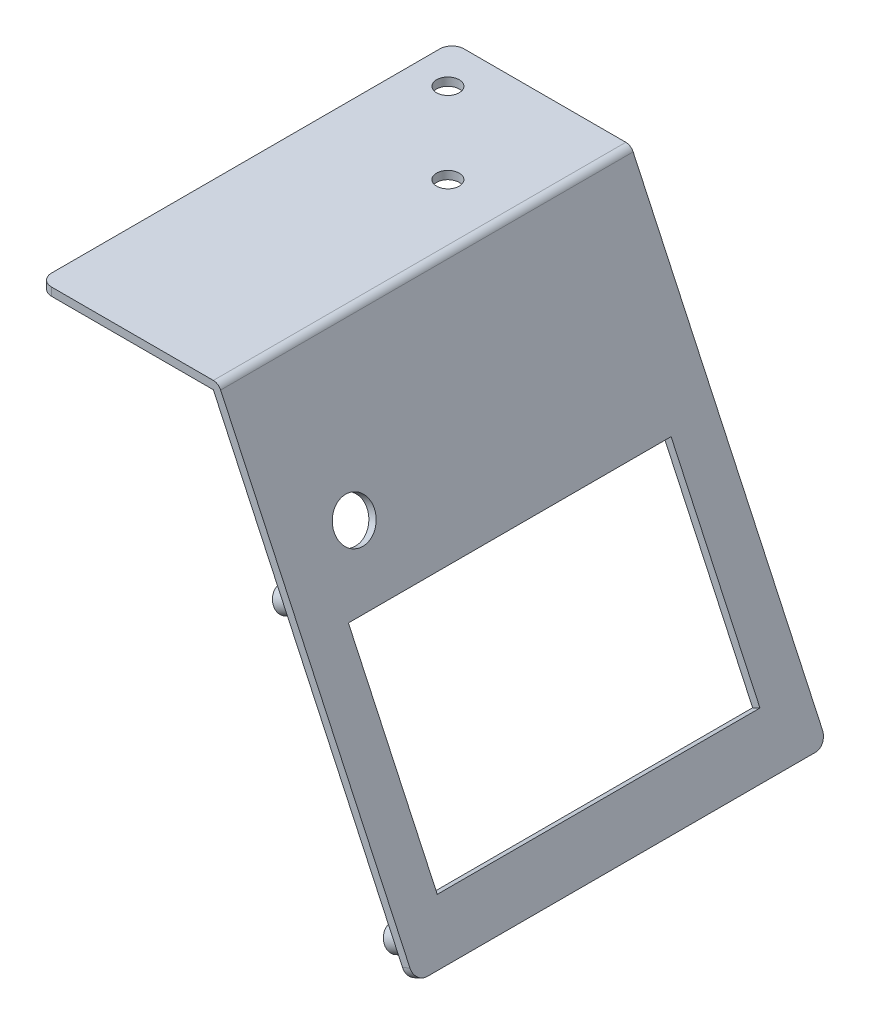
ISO-10303-21;
HEADER;
FILE_DESCRIPTION(('STEP AP214'),'2;1');
FILE_NAME('part.step','',(''),(''),'','','');
FILE_SCHEMA(('AUTOMOTIVE_DESIGN { 1 0 10303 214 1 1 1 1 }'));
ENDSEC;
DATA;
#1=APPLICATION_CONTEXT('core data for automotive mechanical design processes');
#2=APPLICATION_PROTOCOL_DEFINITION('international standard','automotive_design',2000,#1);
#3=PRODUCT_CONTEXT('',#1,'mechanical');
#4=PRODUCT('Part','Part','',(#3));
#5=PRODUCT_RELATED_PRODUCT_CATEGORY('part','',(#4));
#6=PRODUCT_DEFINITION_FORMATION('','',#4);
#7=PRODUCT_DEFINITION_CONTEXT('part definition',#1,'design');
#8=PRODUCT_DEFINITION('design','',#6,#7);
#9=PRODUCT_DEFINITION_SHAPE('','',#8);
#10=(LENGTH_UNIT() NAMED_UNIT(*) SI_UNIT(.MILLI.,.METRE.));
#11=(NAMED_UNIT(*) PLANE_ANGLE_UNIT() SI_UNIT($,.RADIAN.));
#12=(NAMED_UNIT(*) SI_UNIT($,.STERADIAN.) SOLID_ANGLE_UNIT());
#13=UNCERTAINTY_MEASURE_WITH_UNIT(LENGTH_MEASURE(1.E-05),#10,'distance_accuracy_value','');
#14=(GEOMETRIC_REPRESENTATION_CONTEXT(3) GLOBAL_UNCERTAINTY_ASSIGNED_CONTEXT((#13)) GLOBAL_UNIT_ASSIGNED_CONTEXT((#10,
#11,#12)) REPRESENTATION_CONTEXT('',''));
#15=CARTESIAN_POINT('',(0.,0.,0.));
#16=DIRECTION('',(0.,0.,1.));
#17=DIRECTION('',(1.,0.,0.));
#18=AXIS2_PLACEMENT_3D('',#15,#16,#17);
#19=CARTESIAN_POINT('',(92.8752406217959,-104.225395509215,102.));
#20=DIRECTION('',(0.422618261740697,-0.906307787036651,0.));
#21=DIRECTION('',(0.906307787036651,0.422618261740697,0.));
#22=AXIS2_PLACEMENT_3D('',#19,#20,#21);
#23=PLANE('',#22);
#24=DIRECTION('',(0.,0.,-1.));
#25=VECTOR('',#24,1.);
#26=CARTESIAN_POINT('',(92.8752406217959,-104.225395509215,102.));
#27=LINE('',#26,#25);
#28=CARTESIAN_POINT('',(92.8752406217959,-104.225395509215,99.));
#29=VERTEX_POINT('',#28);
#30=CARTESIAN_POINT('',(92.8752406217959,-104.225395509215,3.));
#31=VERTEX_POINT('',#30);
#32=EDGE_CURVE('E199',#29,#31,#27,.T.);
#33=ORIENTED_EDGE('',*,*,#32,.F.);
#34=DIRECTION('',(-0.906307787036651,-0.422618261740697,0.));
#35=VECTOR('',#34,1.);
#36=CARTESIAN_POINT('',(91.0626250477226,-105.070632032696,99.));
#37=LINE('',#36,#35);
#38=CARTESIAN_POINT('',(91.0626250477226,-105.070632032696,99.));
#39=VERTEX_POINT('',#38);
#40=EDGE_CURVE('E242',#29,#39,#37,.T.);
#41=ORIENTED_EDGE('',*,*,#40,.T.);
#42=DIRECTION('',(0.,0.,-1.));
#43=VECTOR('',#42,1.);
#44=CARTESIAN_POINT('',(91.0626250477226,-105.070632032696,102.));
#45=LINE('',#44,#43);
#46=CARTESIAN_POINT('',(91.0626250477226,-105.070632032696,3.));
#47=VERTEX_POINT('',#46);
#48=EDGE_CURVE('E190',#39,#47,#45,.T.);
#49=ORIENTED_EDGE('',*,*,#48,.T.);
#50=DIRECTION('',(-0.906307787036651,-0.422618261740697,0.));
#51=VECTOR('',#50,1.);
#52=CARTESIAN_POINT('',(92.8752406217959,-104.225395509215,3.));
#53=LINE('',#52,#51);
#54=EDGE_CURVE('E240',#47,#31,#53,.F.);
#55=ORIENTED_EDGE('',*,*,#54,.T.);
#56=EDGE_LOOP('',(#33,#41,#49,#55));
#57=FACE_BOUND('',#56,.T.);
#58=ADVANCED_FACE('F37',(#57),#23,.T.);
#59=CARTESIAN_POINT('',(44.2741405216157,3.70279042205781E-13,102.));
#60=DIRECTION('',(0.906307787036651,0.422618261740697,0.));
#61=DIRECTION('',(-0.422618261740697,0.906307787036651,0.));
#62=AXIS2_PLACEMENT_3D('',#59,#60,#61);
#63=PLANE('',#62);
#64=CARTESIAN_POINT('',(58.9366830246469,-31.4439238700159,83.1));
#65=DIRECTION('',(0.906307787036651,0.422618261740697,0.));
#66=DIRECTION('',(-0.422618261740697,0.906307787036651,0.));
#67=AXIS2_PLACEMENT_3D('',#64,#65,#66);
#68=CIRCLE('',#67,4.99999999999998);
#69=CARTESIAN_POINT('',(56.8235917159435,-26.9123849348326,83.1));
#70=VERTEX_POINT('',#69);
#71=EDGE_CURVE('E378',#70,#70,#68,.T.);
#72=ORIENTED_EDGE('',*,*,#71,.F.);
#73=EDGE_LOOP('',(#72));
#74=FACE_BOUND('',#73,.T.);
#75=DIRECTION('',(-0.422618261740704,0.906307787036648,0.));
#76=VECTOR('',#75,1.);
#77=CARTESIAN_POINT('',(87.6747248230152,-93.0728533885078,11.5000000000001));
#78=LINE('',#77,#76);
#79=CARTESIAN_POINT('',(87.6747248230152,-93.0728533885078,11.5000000000001));
#80=VERTEX_POINT('',#79);
#81=CARTESIAN_POINT('',(65.6985752124981,-45.9448484626023,11.5000000000001));
#82=VERTEX_POINT('',#81);
#83=EDGE_CURVE('E165',#80,#82,#78,.T.);
#84=ORIENTED_EDGE('',*,*,#83,.F.);
#85=DIRECTION('',(0.,0.,-1.));
#86=VECTOR('',#85,1.);
#87=CARTESIAN_POINT('',(87.6747248230152,-93.0728533885077,91.3));
#88=LINE('',#87,#86);
#89=CARTESIAN_POINT('',(87.6747248230152,-93.0728533885077,91.3));
#90=VERTEX_POINT('',#89);
#91=EDGE_CURVE('E170',#90,#80,#88,.T.);
#92=ORIENTED_EDGE('',*,*,#91,.F.);
#93=DIRECTION('',(0.422618261740704,-0.906307787036648,0.));
#94=VECTOR('',#93,1.);
#95=CARTESIAN_POINT('',(65.6985752124986,-45.944848462602,91.3));
#96=LINE('',#95,#94);
#97=CARTESIAN_POINT('',(65.6985752124986,-45.944848462602,91.3));
#98=VERTEX_POINT('',#97);
#99=EDGE_CURVE('E149',#98,#90,#96,.T.);
#100=ORIENTED_EDGE('',*,*,#99,.F.);
#101=DIRECTION('',(0.,0.,1.));
#102=VECTOR('',#101,1.);
#103=CARTESIAN_POINT('',(65.6985752124986,-45.944848462602,11.5000000000001));
#104=LINE('',#103,#102);
#105=EDGE_CURVE('E160',#82,#98,#104,.T.);
#106=ORIENTED_EDGE('',*,*,#105,.F.);
#107=EDGE_LOOP('',(#84,#92,#100,#106));
#108=FACE_BOUND('',#107,.T.);
#109=DIRECTION('',(0.422618261740697,-0.906307787036651,0.));
#110=VECTOR('',#109,1.);
#111=CARTESIAN_POINT('',(44.2741405216157,3.70279042205781E-13,102.));
#112=LINE('',#111,#110);
#113=CARTESIAN_POINT('',(44.812615574074,-1.15476347651825,102.));
#114=VERTEX_POINT('',#113);
#115=CARTESIAN_POINT('',(91.6073858365738,-101.506472148105,102.));
#116=VERTEX_POINT('',#115);
#117=EDGE_CURVE('E187',#114,#116,#112,.T.);
#118=ORIENTED_EDGE('',*,*,#117,.T.);
#119=CARTESIAN_POINT('',(91.6073858365738,-101.506472148105,99.));
#120=DIRECTION('',(0.906307787036651,0.422618261740697,0.));
#121=DIRECTION('',(-0.422618261740697,0.906307787036651,0.));
#122=AXIS2_PLACEMENT_3D('',#119,#120,#121);
#123=CIRCLE('',#122,3.);
#124=EDGE_CURVE('E255',#116,#29,#123,.T.);
#125=ORIENTED_EDGE('',*,*,#124,.T.);
#126=ORIENTED_EDGE('',*,*,#32,.T.);
#127=CARTESIAN_POINT('',(91.6073858365738,-101.506472148105,3.));
#128=DIRECTION('',(0.906307787036651,0.422618261740697,0.));
#129=DIRECTION('',(-0.422618261740697,0.906307787036651,0.));
#130=AXIS2_PLACEMENT_3D('',#127,#128,#129);
#131=CIRCLE('',#130,3.);
#132=CARTESIAN_POINT('',(91.6073858365738,-101.506472148105,0.));
#133=VERTEX_POINT('',#132);
#134=EDGE_CURVE('E253',#31,#133,#131,.T.);
#135=ORIENTED_EDGE('',*,*,#134,.T.);
#136=DIRECTION('',(0.422618261740697,-0.906307787036651,0.));
#137=VECTOR('',#136,1.);
#138=CARTESIAN_POINT('',(44.2741405216157,3.70279042205781E-13,0.));
#139=LINE('',#138,#137);
#140=CARTESIAN_POINT('',(44.812615574074,-1.15476347651825,0.));
#141=VERTEX_POINT('',#140);
#142=EDGE_CURVE('E183',#141,#133,#139,.T.);
#143=ORIENTED_EDGE('',*,*,#142,.F.);
#144=DIRECTION('',(0.,0.,-1.));
#145=VECTOR('',#144,1.);
#146=CARTESIAN_POINT('',(44.812615574074,-1.15476347651825,102.));
#147=LINE('',#146,#145);
#148=EDGE_CURVE('E235',#141,#114,#147,.F.);
#149=ORIENTED_EDGE('',*,*,#148,.T.);
#150=EDGE_LOOP('',(#118,#125,#126,#135,#143,#149));
#151=FACE_BOUND('',#150,.T.);
#152=ADVANCED_FACE('F167',(#74,#108,#151),#63,.T.);
#153=CARTESIAN_POINT('',(0.,0.,102.));
#154=DIRECTION('',(0.,1.,0.));
#155=DIRECTION('',(-1.,0.,0.));
#156=AXIS2_PLACEMENT_3D('',#153,#154,#155);
#157=PLANE('',#156);
#158=CARTESIAN_POINT('',(28.9999999999989,0.,29.9999999999999));
#159=DIRECTION('',(0.,-1.,0.));
#160=DIRECTION('',(0.,0.,-1.));
#161=AXIS2_PLACEMENT_3D('',#158,#159,#160);
#162=CIRCLE('',#161,2.80000000000105);
#163=CARTESIAN_POINT('',(28.9999999999989,0.,27.1999999999988));
#164=VERTEX_POINT('',#163);
#165=EDGE_CURVE('E388',#164,#164,#162,.T.);
#166=ORIENTED_EDGE('',*,*,#165,.T.);
#167=EDGE_LOOP('',(#166));
#168=FACE_BOUND('',#167,.T.);
#169=CARTESIAN_POINT('',(8.9999999999989,0.,9.99999999999991));
#170=DIRECTION('',(0.,-1.,0.));
#171=DIRECTION('',(0.,0.,-1.));
#172=AXIS2_PLACEMENT_3D('',#169,#170,#171);
#173=CIRCLE('',#172,2.80000000000105);
#174=CARTESIAN_POINT('',(8.9999999999989,0.,7.19999999999886));
#175=VERTEX_POINT('',#174);
#176=EDGE_CURVE('E382',#175,#175,#173,.T.);
#177=ORIENTED_EDGE('',*,*,#176,.T.);
#178=EDGE_LOOP('',(#177));
#179=FACE_BOUND('',#178,.T.);
#180=DIRECTION('',(1.,0.,0.));
#181=VECTOR('',#180,1.);
#182=CARTESIAN_POINT('',(0.,0.,0.));
#183=LINE('',#182,#181);
#184=CARTESIAN_POINT('',(3.,0.,0.));
#185=VERTEX_POINT('',#184);
#186=CARTESIAN_POINT('',(43.0000000000007,3.59622990469467E-13,0.));
#187=VERTEX_POINT('',#186);
#188=EDGE_CURVE('E195',#185,#187,#183,.T.);
#189=ORIENTED_EDGE('',*,*,#188,.F.);
#190=CARTESIAN_POINT('',(3.,0.,3.));
#191=DIRECTION('',(0.,1.,0.));
#192=DIRECTION('',(-1.,0.,0.));
#193=AXIS2_PLACEMENT_3D('',#190,#191,#192);
#194=CIRCLE('',#193,3.);
#195=CARTESIAN_POINT('',(0.,0.,3.));
#196=VERTEX_POINT('',#195);
#197=EDGE_CURVE('E265',#185,#196,#194,.T.);
#198=ORIENTED_EDGE('',*,*,#197,.T.);
#199=DIRECTION('',(0.,0.,-1.));
#200=VECTOR('',#199,1.);
#201=CARTESIAN_POINT('',(0.,0.,102.));
#202=LINE('',#201,#200);
#203=CARTESIAN_POINT('',(0.,0.,99.));
#204=VERTEX_POINT('',#203);
#205=EDGE_CURVE('E203',#204,#196,#202,.T.);
#206=ORIENTED_EDGE('',*,*,#205,.F.);
#207=CARTESIAN_POINT('',(3.,0.,99.));
#208=DIRECTION('',(0.,1.,0.));
#209=DIRECTION('',(-1.,0.,0.));
#210=AXIS2_PLACEMENT_3D('',#207,#208,#209);
#211=CIRCLE('',#210,3.);
#212=CARTESIAN_POINT('',(3.,0.,102.));
#213=VERTEX_POINT('',#212);
#214=EDGE_CURVE('E263',#204,#213,#211,.T.);
#215=ORIENTED_EDGE('',*,*,#214,.T.);
#216=DIRECTION('',(1.,0.,0.));
#217=VECTOR('',#216,1.);
#218=CARTESIAN_POINT('',(0.,0.,102.));
#219=LINE('',#218,#217);
#220=CARTESIAN_POINT('',(43.0000000000007,3.59622990469467E-13,102.));
#221=VERTEX_POINT('',#220);
#222=EDGE_CURVE('E185',#213,#221,#219,.T.);
#223=ORIENTED_EDGE('',*,*,#222,.T.);
#224=DIRECTION('',(0.,0.,-1.));
#225=VECTOR('',#224,1.);
#226=CARTESIAN_POINT('',(43.0000000000007,3.59622990469467E-13,102.));
#227=LINE('',#226,#225);
#228=EDGE_CURVE('E230',#221,#187,#227,.T.);
#229=ORIENTED_EDGE('',*,*,#228,.T.);
#230=EDGE_LOOP('',(#189,#198,#206,#215,#223,#229));
#231=FACE_BOUND('',#230,.T.);
#232=ADVANCED_FACE('F276',(#168,#179,#231),#157,.T.);
#233=CARTESIAN_POINT('',(0.,-2.,102.));
#234=DIRECTION('',(-1.,0.,0.));
#235=DIRECTION('',(0.,0.,1.));
#236=AXIS2_PLACEMENT_3D('',#233,#234,#235);
#237=PLANE('',#236);
#238=ORIENTED_EDGE('',*,*,#205,.T.);
#239=DIRECTION('',(0.,1.,0.));
#240=VECTOR('',#239,1.);
#241=CARTESIAN_POINT('',(0.,-2.,3.));
#242=LINE('',#241,#240);
#243=CARTESIAN_POINT('',(0.,-2.,3.));
#244=VERTEX_POINT('',#243);
#245=EDGE_CURVE('E52',#196,#244,#242,.F.);
#246=ORIENTED_EDGE('',*,*,#245,.T.);
#247=DIRECTION('',(0.,0.,-1.));
#248=VECTOR('',#247,1.);
#249=CARTESIAN_POINT('',(0.,-2.,102.));
#250=LINE('',#249,#248);
#251=CARTESIAN_POINT('',(0.,-2.,99.));
#252=VERTEX_POINT('',#251);
#253=EDGE_CURVE('E205',#252,#244,#250,.T.);
#254=ORIENTED_EDGE('',*,*,#253,.F.);
#255=DIRECTION('',(0.,1.,0.));
#256=VECTOR('',#255,1.);
#257=CARTESIAN_POINT('',(0.,0.,99.));
#258=LINE('',#257,#256);
#259=EDGE_CURVE('E267',#252,#204,#258,.T.);
#260=ORIENTED_EDGE('',*,*,#259,.T.);
#261=EDGE_LOOP('',(#238,#246,#254,#260));
#262=FACE_BOUND('',#261,.T.);
#263=ADVANCED_FACE('F272',(#262),#237,.T.);
#264=CARTESIAN_POINT('',(43.0000000000008,-1.99999999999965,102.));
#265=DIRECTION('',(0.,-1.,0.));
#266=DIRECTION('',(1.,0.,0.));
#267=AXIS2_PLACEMENT_3D('',#264,#265,#266);
#268=PLANE('',#267);
#269=CARTESIAN_POINT('',(28.9999999999989,-2.,29.9999999999999));
#270=DIRECTION('',(0.,-1.,0.));
#271=DIRECTION('',(0.,0.,-1.));
#272=AXIS2_PLACEMENT_3D('',#269,#270,#271);
#273=CIRCLE('',#272,2.80000000000105);
#274=CARTESIAN_POINT('',(28.9999999999989,-2.,27.1999999999988));
#275=VERTEX_POINT('',#274);
#276=EDGE_CURVE('E391',#275,#275,#273,.T.);
#277=ORIENTED_EDGE('',*,*,#276,.F.);
#278=EDGE_LOOP('',(#277));
#279=FACE_BOUND('',#278,.T.);
#280=CARTESIAN_POINT('',(8.9999999999989,-2.,9.99999999999991));
#281=DIRECTION('',(0.,-1.,0.));
#282=DIRECTION('',(0.,0.,-1.));
#283=AXIS2_PLACEMENT_3D('',#280,#281,#282);
#284=CIRCLE('',#283,2.80000000000105);
#285=CARTESIAN_POINT('',(8.9999999999989,-2.,7.19999999999886));
#286=VERTEX_POINT('',#285);
#287=EDGE_CURVE('E385',#286,#286,#284,.T.);
#288=ORIENTED_EDGE('',*,*,#287,.F.);
#289=EDGE_LOOP('',(#288));
#290=FACE_BOUND('',#289,.T.);
#291=ORIENTED_EDGE('',*,*,#253,.T.);
#292=CARTESIAN_POINT('',(3.,-1.99999999999998,3.));
#293=DIRECTION('',(0.,-1.,0.));
#294=DIRECTION('',(1.,0.,0.));
#295=AXIS2_PLACEMENT_3D('',#292,#293,#294);
#296=CIRCLE('',#295,3.);
#297=CARTESIAN_POINT('',(3.,-1.99999999999998,0.));
#298=VERTEX_POINT('',#297);
#299=EDGE_CURVE('E11',#244,#298,#296,.T.);
#300=ORIENTED_EDGE('',*,*,#299,.T.);
#301=DIRECTION('',(-1.,0.,0.));
#302=VECTOR('',#301,1.);
#303=CARTESIAN_POINT('',(43.0000000000008,-1.99999999999965,0.));
#304=LINE('',#303,#302);
#305=CARTESIAN_POINT('',(43.0000000000008,-1.99999999999965,0.));
#306=VERTEX_POINT('',#305);
#307=EDGE_CURVE('E192',#306,#298,#304,.T.);
#308=ORIENTED_EDGE('',*,*,#307,.F.);
#309=DIRECTION('',(0.,0.,-1.));
#310=VECTOR('',#309,1.);
#311=CARTESIAN_POINT('',(43.0000000000008,-1.99999999999965,102.));
#312=LINE('',#311,#310);
#313=CARTESIAN_POINT('',(43.0000000000008,-1.99999999999965,102.));
#314=VERTEX_POINT('',#313);
#315=EDGE_CURVE('E207',#314,#306,#312,.T.);
#316=ORIENTED_EDGE('',*,*,#315,.F.);
#317=DIRECTION('',(-1.,0.,0.));
#318=VECTOR('',#317,1.);
#319=CARTESIAN_POINT('',(43.0000000000008,-1.99999999999965,102.));
#320=LINE('',#319,#318);
#321=CARTESIAN_POINT('',(3.,-1.99999999999998,102.));
#322=VERTEX_POINT('',#321);
#323=EDGE_CURVE('E182',#314,#322,#320,.T.);
#324=ORIENTED_EDGE('',*,*,#323,.T.);
#325=CARTESIAN_POINT('',(3.,-1.99999999999998,99.));
#326=DIRECTION('',(0.,-1.,0.));
#327=DIRECTION('',(1.,0.,0.));
#328=AXIS2_PLACEMENT_3D('',#325,#326,#327);
#329=CIRCLE('',#328,3.);
#330=EDGE_CURVE('E45',#322,#252,#329,.T.);
#331=ORIENTED_EDGE('',*,*,#330,.T.);
#332=EDGE_LOOP('',(#291,#300,#308,#316,#324,#331));
#333=FACE_BOUND('',#332,.T.);
#334=ADVANCED_FACE('F288',(#279,#290,#333),#268,.T.);
#335=CARTESIAN_POINT('',(91.0626250477226,-105.070632032696,102.));
#336=DIRECTION('',(-0.906307787036651,-0.422618261740697,0.));
#337=DIRECTION('',(0.422618261740697,-0.906307787036651,0.));
#338=AXIS2_PLACEMENT_3D('',#335,#336,#337);
#339=PLANE('',#338);
#340=CARTESIAN_POINT('',(57.1240674505741,-32.2891603934971,83.1));
#341=DIRECTION('',(-0.906307787036648,-0.422618261740704,0.));
#342=DIRECTION('',(0.422618261740704,-0.906307787036648,0.));
#343=AXIS2_PLACEMENT_3D('',#340,#341,#342);
#344=CIRCLE('',#343,4.99999999999999);
#345=CARTESIAN_POINT('',(59.2371587592776,-36.8206993286803,83.1));
#346=VERTEX_POINT('',#345);
#347=EDGE_CURVE('E349',#346,#346,#344,.T.);
#348=ORIENTED_EDGE('',*,*,#347,.F.);
#349=EDGE_LOOP('',(#348));
#350=FACE_BOUND('',#349,.T.);
#351=CARTESIAN_POINT('',(61.1600718501972,-40.944399759697,8.04999999999999));
#352=DIRECTION('',(-0.906307787036651,-0.422618261740697,0.));
#353=DIRECTION('',(0.422618261740697,-0.906307787036651,0.));
#354=AXIS2_PLACEMENT_3D('',#351,#352,#353);
#355=CIRCLE('',#354,3.00000000000001);
#356=CARTESIAN_POINT('',(62.4279266354193,-43.6633231208069,8.04999999999999));
#357=VERTEX_POINT('',#356);
#358=EDGE_CURVE('E227',#357,#357,#355,.T.);
#359=ORIENTED_EDGE('',*,*,#358,.F.);
#360=EDGE_LOOP('',(#359));
#361=FACE_BOUND('',#360,.T.);
#362=CARTESIAN_POINT('',(88.5879970371684,-99.7637751383756,8.04999999999999));
#363=DIRECTION('',(-0.906307787036651,-0.422618261740697,0.));
#364=DIRECTION('',(0.422618261740697,-0.906307787036651,0.));
#365=AXIS2_PLACEMENT_3D('',#362,#363,#364);
#366=CIRCLE('',#365,2.99999999999999);
#367=CARTESIAN_POINT('',(87.3201422519463,-97.0448517772657,8.04999999999999));
#368=VERTEX_POINT('',#367);
#369=EDGE_CURVE('E224',#368,#368,#366,.T.);
#370=ORIENTED_EDGE('',*,*,#369,.F.);
#371=EDGE_LOOP('',(#370));
#372=FACE_BOUND('',#371,.T.);
#373=CARTESIAN_POINT('',(88.5879970371684,-99.7637751383756,95.95));
#374=DIRECTION('',(-0.906307787036651,-0.422618261740697,0.));
#375=DIRECTION('',(0.422618261740697,-0.906307787036651,0.));
#376=AXIS2_PLACEMENT_3D('',#373,#374,#375);
#377=CIRCLE('',#376,2.99999999999999);
#378=CARTESIAN_POINT('',(89.8558518223905,-102.482698499486,95.95));
#379=VERTEX_POINT('',#378);
#380=EDGE_CURVE('E221',#379,#379,#377,.T.);
#381=ORIENTED_EDGE('',*,*,#380,.F.);
#382=EDGE_LOOP('',(#381));
#383=FACE_BOUND('',#382,.T.);
#384=CARTESIAN_POINT('',(61.1600718501972,-40.944399759697,95.95));
#385=DIRECTION('',(-0.906307787036651,-0.422618261740697,0.));
#386=DIRECTION('',(0.422618261740697,-0.906307787036651,0.));
#387=AXIS2_PLACEMENT_3D('',#384,#385,#386);
#388=CIRCLE('',#387,3.00000000000001);
#389=CARTESIAN_POINT('',(62.4279266354193,-43.6633231208069,95.95));
#390=VERTEX_POINT('',#389);
#391=EDGE_CURVE('E218',#390,#390,#388,.T.);
#392=ORIENTED_EDGE('',*,*,#391,.F.);
#393=EDGE_LOOP('',(#392));
#394=FACE_BOUND('',#393,.T.);
#395=DIRECTION('',(0.422618261740697,-0.906307787036651,0.));
#396=VECTOR('',#395,1.);
#397=CARTESIAN_POINT('',(91.0626250477226,-105.070632032696,11.5000000000001));
#398=LINE('',#397,#396);
#399=CARTESIAN_POINT('',(63.8859596384248,-46.7900849860837,11.5000000000001));
#400=VERTEX_POINT('',#399);
#401=CARTESIAN_POINT('',(85.8621092489411,-93.9180899119896,11.5000000000001));
#402=VERTEX_POINT('',#401);
#403=EDGE_CURVE('E216',#400,#402,#398,.T.);
#404=ORIENTED_EDGE('',*,*,#403,.F.);
#405=DIRECTION('',(0.,0.,-1.));
#406=VECTOR('',#405,1.);
#407=CARTESIAN_POINT('',(63.8859596384248,-46.7900849860837,102.));
#408=LINE('',#407,#406);
#409=CARTESIAN_POINT('',(63.8859596384248,-46.7900849860837,91.3));
#410=VERTEX_POINT('',#409);
#411=EDGE_CURVE('E202',#410,#400,#408,.T.);
#412=ORIENTED_EDGE('',*,*,#411,.F.);
#413=DIRECTION('',(-0.422618261740697,0.906307787036651,0.));
#414=VECTOR('',#413,1.);
#415=CARTESIAN_POINT('',(91.0626250477226,-105.070632032696,91.3));
#416=LINE('',#415,#414);
#417=CARTESIAN_POINT('',(85.8621092489411,-93.9180899119896,91.3));
#418=VERTEX_POINT('',#417);
#419=EDGE_CURVE('E152',#418,#410,#416,.T.);
#420=ORIENTED_EDGE('',*,*,#419,.F.);
#421=DIRECTION('',(0.,0.,1.));
#422=VECTOR('',#421,1.);
#423=CARTESIAN_POINT('',(85.8621092489411,-93.9180899119896,102.));
#424=LINE('',#423,#422);
#425=EDGE_CURVE('E214',#402,#418,#424,.T.);
#426=ORIENTED_EDGE('',*,*,#425,.F.);
#427=EDGE_LOOP('',(#404,#412,#420,#426));
#428=FACE_BOUND('',#427,.T.);
#429=ORIENTED_EDGE('',*,*,#48,.F.);
#430=CARTESIAN_POINT('',(89.7947702625005,-102.351708671586,99.));
#431=DIRECTION('',(-0.906307787036651,-0.422618261740697,0.));
#432=DIRECTION('',(0.422618261740697,-0.906307787036651,0.));
#433=AXIS2_PLACEMENT_3D('',#430,#431,#432);
#434=CIRCLE('',#433,3.);
#435=CARTESIAN_POINT('',(89.7947702625005,-102.351708671586,102.));
#436=VERTEX_POINT('',#435);
#437=EDGE_CURVE('E247',#39,#436,#434,.T.);
#438=ORIENTED_EDGE('',*,*,#437,.T.);
#439=DIRECTION('',(-0.422618261740697,0.906307787036651,0.));
#440=VECTOR('',#439,1.);
#441=CARTESIAN_POINT('',(91.0626250477226,-105.070632032696,102.));
#442=LINE('',#441,#440);
#443=EDGE_CURVE('E180',#436,#314,#442,.T.);
#444=ORIENTED_EDGE('',*,*,#443,.T.);
#445=ORIENTED_EDGE('',*,*,#315,.T.);
#446=DIRECTION('',(-0.422618261740697,0.906307787036651,0.));
#447=VECTOR('',#446,1.);
#448=CARTESIAN_POINT('',(91.0626250477226,-105.070632032696,0.));
#449=LINE('',#448,#447);
#450=CARTESIAN_POINT('',(89.7947702625005,-102.351708671586,0.));
#451=VERTEX_POINT('',#450);
#452=EDGE_CURVE('E177',#451,#306,#449,.T.);
#453=ORIENTED_EDGE('',*,*,#452,.F.);
#454=CARTESIAN_POINT('',(89.7947702625005,-102.351708671586,3.));
#455=DIRECTION('',(-0.906307787036651,-0.422618261740697,0.));
#456=DIRECTION('',(0.422618261740697,-0.906307787036651,0.));
#457=AXIS2_PLACEMENT_3D('',#454,#455,#456);
#458=CIRCLE('',#457,3.);
#459=EDGE_CURVE('E245',#451,#47,#458,.T.);
#460=ORIENTED_EDGE('',*,*,#459,.T.);
#461=EDGE_LOOP('',(#429,#438,#444,#445,#453,#460));
#462=FACE_BOUND('',#461,.T.);
#463=ADVANCED_FACE('F316',(#350,#361,#372,#383,#394,#428,#462),#339,.T.);
#464=CARTESIAN_POINT('',(0.,0.,102.));
#465=DIRECTION('',(0.,0.,-1.));
#466=DIRECTION('',(-1.,0.,0.));
#467=AXIS2_PLACEMENT_3D('',#464,#465,#466);
#468=PLANE('',#467);
#469=ORIENTED_EDGE('',*,*,#443,.F.);
#470=DIRECTION('',(-0.906307787036651,-0.422618261740697,0.));
#471=VECTOR('',#470,1.);
#472=CARTESIAN_POINT('',(91.6073858365738,-101.506472148105,102.));
#473=LINE('',#472,#471);
#474=EDGE_CURVE('E251',#436,#116,#473,.F.);
#475=ORIENTED_EDGE('',*,*,#474,.T.);
#476=ORIENTED_EDGE('',*,*,#117,.F.);
#477=CARTESIAN_POINT('',(43.0000000000007,-1.99999999999964,102.));
#478=DIRECTION('',(0.,0.,-1.));
#479=DIRECTION('',(-1.,0.,0.));
#480=AXIS2_PLACEMENT_3D('',#477,#478,#479);
#481=CIRCLE('',#480,2.);
#482=EDGE_CURVE('E237',#114,#221,#481,.F.);
#483=ORIENTED_EDGE('',*,*,#482,.T.);
#484=ORIENTED_EDGE('',*,*,#222,.F.);
#485=DIRECTION('',(0.,1.,0.));
#486=VECTOR('',#485,1.);
#487=CARTESIAN_POINT('',(3.,-2.,102.));
#488=LINE('',#487,#486);
#489=EDGE_CURVE('E249',#213,#322,#488,.F.);
#490=ORIENTED_EDGE('',*,*,#489,.T.);
#491=ORIENTED_EDGE('',*,*,#323,.F.);
#492=EDGE_LOOP('',(#469,#475,#476,#483,#484,#490,#491));
#493=FACE_BOUND('',#492,.T.);
#494=ADVANCED_FACE('F293',(#493),#468,.F.);
#495=CARTESIAN_POINT('',(0.,0.,0.));
#496=DIRECTION('',(0.,0.,-1.));
#497=DIRECTION('',(-1.,0.,0.));
#498=AXIS2_PLACEMENT_3D('',#495,#496,#497);
#499=PLANE('',#498);
#500=ORIENTED_EDGE('',*,*,#307,.T.);
#501=DIRECTION('',(0.,1.,0.));
#502=VECTOR('',#501,1.);
#503=CARTESIAN_POINT('',(3.,0.,0.));
#504=LINE('',#503,#502);
#505=EDGE_CURVE('E260',#298,#185,#504,.T.);
#506=ORIENTED_EDGE('',*,*,#505,.T.);
#507=ORIENTED_EDGE('',*,*,#188,.T.);
#508=CARTESIAN_POINT('',(43.0000000000007,-1.99999999999964,0.));
#509=DIRECTION('',(0.,0.,-1.));
#510=DIRECTION('',(-1.,0.,0.));
#511=AXIS2_PLACEMENT_3D('',#508,#509,#510);
#512=CIRCLE('',#511,2.);
#513=EDGE_CURVE('E233',#187,#141,#512,.T.);
#514=ORIENTED_EDGE('',*,*,#513,.T.);
#515=ORIENTED_EDGE('',*,*,#142,.T.);
#516=DIRECTION('',(-0.906307787036651,-0.422618261740697,0.));
#517=VECTOR('',#516,1.);
#518=CARTESIAN_POINT('',(55.2408810973581,-118.464451808331,0.));
#519=LINE('',#518,#517);
#520=EDGE_CURVE('E257',#133,#451,#519,.T.);
#521=ORIENTED_EDGE('',*,*,#520,.T.);
#522=ORIENTED_EDGE('',*,*,#452,.T.);
#523=EDGE_LOOP('',(#500,#506,#507,#514,#515,#521,#522));
#524=FACE_BOUND('',#523,.T.);
#525=ADVANCED_FACE('F283',(#524),#499,.T.);
#526=CARTESIAN_POINT('',(11.0638331819764,-128.797098858807,11.5000000000001));
#527=DIRECTION('',(0.,0.,-1.));
#528=DIRECTION('',(0.,1.,0.));
#529=AXIS2_PLACEMENT_3D('',#526,#527,#528);
#530=PLANE('',#529);
#531=ORIENTED_EDGE('',*,*,#403,.T.);
#532=DIRECTION('',(0.906307787036648,0.422618261740704,0.));
#533=VECTOR('',#532,1.);
#534=CARTESIAN_POINT('',(11.0638331819764,-128.797098858807,11.5000000000001));
#535=LINE('',#534,#533);
#536=EDGE_CURVE('E175',#402,#80,#535,.T.);
#537=ORIENTED_EDGE('',*,*,#536,.T.);
#538=ORIENTED_EDGE('',*,*,#83,.T.);
#539=DIRECTION('',(0.906307787036648,0.422618261740704,0.));
#540=VECTOR('',#539,1.);
#541=CARTESIAN_POINT('',(-10.9123164285402,-81.6690939329016,11.5000000000001));
#542=LINE('',#541,#540);
#543=EDGE_CURVE('E156',#400,#82,#542,.T.);
#544=ORIENTED_EDGE('',*,*,#543,.F.);
#545=EDGE_LOOP('',(#531,#537,#538,#544));
#546=FACE_BOUND('',#545,.T.);
#547=ADVANCED_FACE('F362',(#546),#530,.F.);
#548=CARTESIAN_POINT('',(11.0638331819764,-128.797098858807,91.3));
#549=DIRECTION('',(0.422618261740704,-0.906307787036648,0.));
#550=DIRECTION('',(0.906307787036648,0.422618261740704,0.));
#551=AXIS2_PLACEMENT_3D('',#548,#549,#550);
#552=PLANE('',#551);
#553=ORIENTED_EDGE('',*,*,#425,.T.);
#554=DIRECTION('',(0.906307787036648,0.422618261740704,0.));
#555=VECTOR('',#554,1.);
#556=CARTESIAN_POINT('',(11.0638331819764,-128.797098858807,91.3));
#557=LINE('',#556,#555);
#558=EDGE_CURVE('E155',#418,#90,#557,.T.);
#559=ORIENTED_EDGE('',*,*,#558,.T.);
#560=ORIENTED_EDGE('',*,*,#91,.T.);
#561=ORIENTED_EDGE('',*,*,#536,.F.);
#562=EDGE_LOOP('',(#553,#559,#560,#561));
#563=FACE_BOUND('',#562,.T.);
#564=ADVANCED_FACE('F364',(#563),#552,.F.);
#565=CARTESIAN_POINT('',(-10.9123164285402,-81.6690939329016,91.3));
#566=DIRECTION('',(0.,0.,1.));
#567=DIRECTION('',(1.,0.,0.));
#568=AXIS2_PLACEMENT_3D('',#565,#566,#567);
#569=PLANE('',#568);
#570=ORIENTED_EDGE('',*,*,#419,.T.);
#571=DIRECTION('',(0.906307787036648,0.422618261740704,0.));
#572=VECTOR('',#571,1.);
#573=CARTESIAN_POINT('',(-10.9123164285402,-81.6690939329016,91.3));
#574=LINE('',#573,#572);
#575=EDGE_CURVE('E144',#410,#98,#574,.T.);
#576=ORIENTED_EDGE('',*,*,#575,.T.);
#577=ORIENTED_EDGE('',*,*,#99,.T.);
#578=ORIENTED_EDGE('',*,*,#558,.F.);
#579=EDGE_LOOP('',(#570,#576,#577,#578));
#580=FACE_BOUND('',#579,.T.);
#581=ADVANCED_FACE('F146',(#580),#569,.F.);
#582=CARTESIAN_POINT('',(-10.9123164285402,-81.6690939329016,11.5000000000001));
#583=DIRECTION('',(-0.422618261740704,0.906307787036648,0.));
#584=DIRECTION('',(-0.906307787036648,-0.422618261740704,0.));
#585=AXIS2_PLACEMENT_3D('',#582,#583,#584);
#586=PLANE('',#585);
#587=ORIENTED_EDGE('',*,*,#411,.T.);
#588=ORIENTED_EDGE('',*,*,#543,.T.);
#589=ORIENTED_EDGE('',*,*,#105,.T.);
#590=ORIENTED_EDGE('',*,*,#575,.F.);
#591=EDGE_LOOP('',(#587,#588,#589,#590));
#592=FACE_BOUND('',#591,.T.);
#593=ADVANCED_FACE('F161',(#592),#586,.F.);
#594=CARTESIAN_POINT('',(53.7745092749178,-44.3883441483327,95.95));
#595=DIRECTION('',(0.906307787036648,0.422618261740704,0.));
#596=DIRECTION('',(-0.422618261740704,0.906307787036648,0.));
#597=AXIS2_PLACEMENT_3D('',#594,#595,#596);
#598=CYLINDRICAL_SURFACE('',#597,3.00000000000001);
#599=CARTESIAN_POINT('',(54.8159173409402,-43.9027275918821,95.95));
#600=DIRECTION('',(0.906307787036648,0.422618261740704,0.));
#601=DIRECTION('',(-0.422618261740704,0.906307787036648,0.));
#602=AXIS2_PLACEMENT_3D('',#599,#600,#601);
#603=CIRCLE('',#602,3.00000000000001);
#604=CARTESIAN_POINT('',(53.5480625557181,-41.1838042307722,95.95));
#605=VERTEX_POINT('',#604);
#606=EDGE_CURVE('E365',#605,#605,#603,.T.);
#607=ORIENTED_EDGE('',*,*,#606,.T.);
#608=EDGE_LOOP('',(#607));
#609=FACE_BOUND('',#608,.T.);
#610=ORIENTED_EDGE('',*,*,#391,.T.);
#611=EDGE_LOOP('',(#610));
#612=FACE_BOUND('',#611,.T.);
#613=ADVANCED_FACE('F454',(#609,#612),#598,.T.);
#614=CARTESIAN_POINT('',(56.0837721261623,-46.6216509529921,95.95));
#615=DIRECTION('',(-0.906307787036648,-0.422618261740704,0.));
#616=DIRECTION('',(0.422618261740704,-0.906307787036648,0.));
#617=AXIS2_PLACEMENT_3D('',#614,#615,#616);
#618=PLANE('',#617);
#619=CARTESIAN_POINT('',(54.8159173409402,-43.9027275918821,95.95));
#620=DIRECTION('',(-0.906307787036648,-0.422618261740704,0.));
#621=DIRECTION('',(0.422618261740704,-0.906307787036648,0.));
#622=AXIS2_PLACEMENT_3D('',#619,#620,#621);
#623=CIRCLE('',#622,1.34999999999999);
#624=CARTESIAN_POINT('',(55.3864519942901,-45.1262431043816,95.95));
#625=VERTEX_POINT('',#624);
#626=EDGE_CURVE('E397',#625,#625,#623,.T.);
#627=ORIENTED_EDGE('',*,*,#626,.F.);
#628=EDGE_LOOP('',(#627));
#629=FACE_BOUND('',#628,.T.);
#630=ORIENTED_EDGE('',*,*,#606,.F.);
#631=EDGE_LOOP('',(#630));
#632=FACE_BOUND('',#631,.T.);
#633=ADVANCED_FACE('F450',(#629,#632),#618,.T.);
#634=CARTESIAN_POINT('',(81.2024344618895,-103.207719527011,95.95));
#635=DIRECTION('',(0.906307787036648,0.422618261740705,0.));
#636=DIRECTION('',(-0.422618261740705,0.906307787036648,0.));
#637=AXIS2_PLACEMENT_3D('',#634,#635,#636);
#638=CYLINDRICAL_SURFACE('',#637,2.99999999999999);
#639=CARTESIAN_POINT('',(82.2438425279118,-102.722102970561,95.95));
#640=DIRECTION('',(0.906307787036648,0.422618261740705,0.));
#641=DIRECTION('',(-0.422618261740705,0.906307787036648,0.));
#642=AXIS2_PLACEMENT_3D('',#639,#640,#641);
#643=CIRCLE('',#642,2.99999999999999);
#644=CARTESIAN_POINT('',(80.9759877426897,-100.003179609451,95.95));
#645=VERTEX_POINT('',#644);
#646=EDGE_CURVE('E367',#645,#645,#643,.T.);
#647=ORIENTED_EDGE('',*,*,#646,.T.);
#648=EDGE_LOOP('',(#647));
#649=FACE_BOUND('',#648,.T.);
#650=ORIENTED_EDGE('',*,*,#380,.T.);
#651=EDGE_LOOP('',(#650));
#652=FACE_BOUND('',#651,.T.);
#653=ADVANCED_FACE('F446',(#649,#652),#638,.T.);
#654=CARTESIAN_POINT('',(83.511697313134,-105.441026331671,95.95));
#655=DIRECTION('',(-0.906307787036648,-0.422618261740705,0.));
#656=DIRECTION('',(0.422618261740705,-0.906307787036648,0.));
#657=AXIS2_PLACEMENT_3D('',#654,#655,#656);
#658=PLANE('',#657);
#659=CARTESIAN_POINT('',(82.2438425279119,-102.722102970561,95.95));
#660=DIRECTION('',(-0.906307787036648,-0.422618261740704,0.));
#661=DIRECTION('',(0.422618261740704,-0.906307787036648,0.));
#662=AXIS2_PLACEMENT_3D('',#659,#660,#661);
#663=CIRCLE('',#662,1.34999999999999);
#664=CARTESIAN_POINT('',(82.8143771812618,-103.94561848306,95.95));
#665=VERTEX_POINT('',#664);
#666=EDGE_CURVE('E403',#665,#665,#663,.T.);
#667=ORIENTED_EDGE('',*,*,#666,.F.);
#668=EDGE_LOOP('',(#667));
#669=FACE_BOUND('',#668,.T.);
#670=ORIENTED_EDGE('',*,*,#646,.F.);
#671=EDGE_LOOP('',(#670));
#672=FACE_BOUND('',#671,.T.);
#673=ADVANCED_FACE('F442',(#669,#672),#658,.T.);
#674=CARTESIAN_POINT('',(81.2024344618895,-103.207719527011,8.04999999999999));
#675=DIRECTION('',(0.906307787036648,0.422618261740704,0.));
#676=DIRECTION('',(-0.422618261740704,0.906307787036648,0.));
#677=AXIS2_PLACEMENT_3D('',#674,#675,#676);
#678=CYLINDRICAL_SURFACE('',#677,2.99999999999999);
#679=CARTESIAN_POINT('',(82.2438425279118,-102.722102970561,8.04999999999999));
#680=DIRECTION('',(0.906307787036648,0.422618261740704,0.));
#681=DIRECTION('',(-0.422618261740704,0.906307787036648,0.));
#682=AXIS2_PLACEMENT_3D('',#679,#680,#681);
#683=CIRCLE('',#682,2.99999999999999);
#684=CARTESIAN_POINT('',(80.9759877426897,-100.003179609451,8.04999999999999));
#685=VERTEX_POINT('',#684);
#686=EDGE_CURVE('E372',#685,#685,#683,.T.);
#687=CARTESIAN_POINT('',(80.9759877426897,-100.003179609451,8.04999999999999));
#688=CARTESIAN_POINT('',(81.0420726854945,-99.9723636945321,8.04999999999999));
#689=CARTESIAN_POINT('',(81.1081576282993,-99.9415477796135,8.04999999999999));
#690=CARTESIAN_POINT('',(81.2403275139088,-99.8799159497763,8.04999999999999));
#691=CARTESIAN_POINT('',(81.3064124567135,-99.8491000348577,8.04999999999999));
#692=CARTESIAN_POINT('',(81.438582342323,-99.7874682050205,8.04999999999999));
#693=CARTESIAN_POINT('',(81.5046672851278,-99.7566522901019,8.04999999999999));
#694=CARTESIAN_POINT('',(81.6368371707373,-99.6950204602647,8.04999999999999));
#695=CARTESIAN_POINT('',(81.702922113542,-99.6642045453461,8.04999999999999));
#696=CARTESIAN_POINT('',(81.8350919991516,-99.6025727155089,8.04999999999999));
#697=CARTESIAN_POINT('',(81.9011769419563,-99.5717568005903,8.04999999999999));
#698=CARTESIAN_POINT('',(82.0333468275658,-99.5101249707532,8.04999999999999));
#699=CARTESIAN_POINT('',(82.0994317703706,-99.4793090558346,8.04999999999999));
#700=CARTESIAN_POINT('',(82.2316016559801,-99.4176772259974,8.04999999999999));
#701=CARTESIAN_POINT('',(82.2976865987848,-99.3868613110788,8.04999999999999));
#702=CARTESIAN_POINT('',(82.4298564843944,-99.3252294812416,8.04999999999999));
#703=CARTESIAN_POINT('',(82.4959414271991,-99.294413566323,8.04999999999999));
#704=CARTESIAN_POINT('',(82.6281113128086,-99.2327817364858,8.04999999999999));
#705=CARTESIAN_POINT('',(82.6941962556134,-99.2019658215672,8.04999999999999));
#706=CARTESIAN_POINT('',(82.8263661412229,-99.14033399173,8.04999999999999));
#707=CARTESIAN_POINT('',(82.8924510840277,-99.1095180768114,8.04999999999999));
#708=CARTESIAN_POINT('',(83.0246209696372,-99.0478862469743,8.04999999999999));
#709=CARTESIAN_POINT('',(83.0907059124419,-99.0170703320557,8.04999999999999));
#710=CARTESIAN_POINT('',(83.2228757980514,-98.9554385022185,8.04999999999999));
#711=CARTESIAN_POINT('',(83.2889607408562,-98.9246225872999,8.04999999999999));
#712=CARTESIAN_POINT('',(83.4211306264657,-98.8629907574627,8.04999999999999));
#713=CARTESIAN_POINT('',(83.4872155692705,-98.8321748425441,8.04999999999999));
#714=CARTESIAN_POINT('',(83.61938545488,-98.7705430127069,8.04999999999999));
#715=CARTESIAN_POINT('',(83.6854703976847,-98.7397270977883,8.04999999999999));
#716=CARTESIAN_POINT('',(83.8176402832943,-98.6780952679511,8.04999999999999));
#717=CARTESIAN_POINT('',(83.883725226099,-98.6472793530325,8.04999999999999));
#718=CARTESIAN_POINT('',(84.0158951117085,-98.5856475231954,8.04999999999999));
#719=CARTESIAN_POINT('',(84.0819800545133,-98.5548316082768,8.04999999999999));
#720=CARTESIAN_POINT('',(84.2141499401228,-98.4931997784396,8.04999999999999));
#721=CARTESIAN_POINT('',(84.2802348829275,-98.462383863521,8.04999999999999));
#722=CARTESIAN_POINT('',(84.4124047685371,-98.4007520336838,8.04999999999999));
#723=CARTESIAN_POINT('',(84.4784897113418,-98.3699361187652,8.04999999999999));
#724=CARTESIAN_POINT('',(84.6106595969513,-98.308304288928,8.04999999999999));
#725=CARTESIAN_POINT('',(84.6767445397561,-98.2774883740094,8.04999999999999));
#726=CARTESIAN_POINT('',(84.8089144253656,-98.2158565441722,8.04999999999999));
#727=CARTESIAN_POINT('',(84.8749993681704,-98.1850406292536,8.04999999999999));
#728=CARTESIAN_POINT('',(85.0071692537799,-98.1234087994165,8.04999999999999));
#729=CARTESIAN_POINT('',(85.0732541965846,-98.0925928844979,8.04999999999999));
#730=CARTESIAN_POINT('',(85.2054240821941,-98.0309610546607,8.04999999999999));
#731=CARTESIAN_POINT('',(85.2715090249989,-98.0001451397421,8.04999999999999));
#732=CARTESIAN_POINT('',(85.4036789106084,-97.9385133099049,8.04999999999999));
#733=CARTESIAN_POINT('',(85.4697638534132,-97.9076973949863,8.04999999999999));
#734=CARTESIAN_POINT('',(85.6019337390227,-97.8460655651491,8.04999999999999));
#735=CARTESIAN_POINT('',(85.6680186818274,-97.8152496502305,8.04999999999999));
#736=CARTESIAN_POINT('',(85.8001885674369,-97.7536178203933,8.04999999999999));
#737=CARTESIAN_POINT('',(85.8662735102417,-97.7228019054747,8.04999999999999));
#738=CARTESIAN_POINT('',(85.9984433958512,-97.6611700756376,8.04999999999999));
#739=CARTESIAN_POINT('',(86.064528338656,-97.630354160719,8.04999999999999));
#740=CARTESIAN_POINT('',(86.1966982242655,-97.5687223308818,8.04999999999999));
#741=CARTESIAN_POINT('',(86.2627831670702,-97.5379064159632,8.04999999999999));
#742=CARTESIAN_POINT('',(86.3949530526797,-97.476274586126,8.04999999999999));
#743=CARTESIAN_POINT('',(86.4610379954845,-97.4454586712074,8.04999999999999));
#744=CARTESIAN_POINT('',(86.593207881094,-97.3838268413702,8.04999999999999));
#745=CARTESIAN_POINT('',(86.6592928238988,-97.3530109264516,8.04999999999999));
#746=CARTESIAN_POINT('',(86.7914627095083,-97.2913790966144,8.04999999999999));
#747=CARTESIAN_POINT('',(86.857547652313,-97.2605631816958,8.04999999999999));
#748=CARTESIAN_POINT('',(86.9897175379226,-97.1989313518587,8.04999999999999));
#749=CARTESIAN_POINT('',(87.0558024807273,-97.1681154369401,8.04999999999999));
#750=CARTESIAN_POINT('',(87.1879723663368,-97.1064836071029,8.04999999999999));
#751=CARTESIAN_POINT('',(87.2540573091416,-97.0756676921843,8.04999999999999));
#752=CARTESIAN_POINT('',(87.3201422519463,-97.0448517772657,8.04999999999999));
#753=B_SPLINE_CURVE_WITH_KNOTS('',3,(#687,#688,#689,#690,#691,#692,#693,#694,#695,#696,#697,
#698,#699,#700,#701,#702,#703,#704,#705,#706,#707,#708,#709,#710,#711,#712,#713,#714,#715,#716,
#717,#718,#719,#720,#721,#722,#723,#724,#725,#726,#727,#728,#729,#730,#731,#732,#733,#734,#735,
#736,#737,#738,#739,#740,#741,#742,#743,#744,#745,#746,#747,#748,#749,#750,#751,#752),
.UNSPECIFIED.,.F.,.F.,(4,2,2,2,2,2,2,2,2,2,2,2,2,2,2,2,2,2,2,2,2,2,2,2,2,2,2,2,2,2,2,2,4),(0.,
0.218750000000009,0.437500000000006,0.656250000000016,0.875000000000013,1.09375000000002,
1.31250000000002,1.53125000000002,1.75000000000003,1.96875000000002,2.18750000000003,
2.40625000000003,2.62500000000004,2.84375000000003,3.06250000000004,3.28125000000004,
3.50000000000004,3.71875000000005,3.93750000000004,4.15625000000005,4.37500000000005,
4.59375000000006,4.81250000000006,5.03125000000007,5.25000000000006,5.46875000000006,
5.68750000000007,5.90625000000007,6.12500000000008,6.34375000000007,6.56250000000008,
6.78125000000008,7.00000000000009),.UNSPECIFIED.);
#754=EDGE_CURVE('BSEAM435',#685,#368,#753,.T.);
#755=ORIENTED_EDGE('',*,*,#686,.T.);
#756=ORIENTED_EDGE('',*,*,#369,.T.);
#757=ORIENTED_EDGE('',*,*,#754,.T.);
#758=ORIENTED_EDGE('',*,*,#754,.F.);
#759=EDGE_LOOP('',(#755,#757,#756,#758));
#760=FACE_BOUND('',#759,.T.);
#761=ADVANCED_FACE('F435',(#760),#678,.T.);
#762=CARTESIAN_POINT('',(83.511697313134,-105.441026331671,8.04999999999999));
#763=DIRECTION('',(-0.906307787036648,-0.422618261740704,0.));
#764=DIRECTION('',(0.422618261740704,-0.906307787036648,0.));
#765=AXIS2_PLACEMENT_3D('',#762,#763,#764);
#766=PLANE('',#765);
#767=CARTESIAN_POINT('',(82.2438425279119,-102.722102970561,8.04999999999999));
#768=DIRECTION('',(-0.906307787036648,-0.422618261740704,0.));
#769=DIRECTION('',(0.422618261740704,-0.906307787036648,0.));
#770=AXIS2_PLACEMENT_3D('',#767,#768,#769);
#771=CIRCLE('',#770,1.34999999999999);
#772=CARTESIAN_POINT('',(82.8143771812618,-103.94561848306,8.04999999999999));
#773=VERTEX_POINT('',#772);
#774=EDGE_CURVE('E409',#773,#773,#771,.T.);
#775=ORIENTED_EDGE('',*,*,#774,.F.);
#776=EDGE_LOOP('',(#775));
#777=FACE_BOUND('',#776,.T.);
#778=ORIENTED_EDGE('',*,*,#686,.F.);
#779=EDGE_LOOP('',(#778));
#780=FACE_BOUND('',#779,.T.);
#781=ADVANCED_FACE('F430',(#777,#780),#766,.T.);
#782=CARTESIAN_POINT('',(53.7745092749178,-44.3883441483327,8.04999999999999));
#783=DIRECTION('',(0.906307787036648,0.422618261740704,0.));
#784=DIRECTION('',(-0.422618261740704,0.906307787036648,0.));
#785=AXIS2_PLACEMENT_3D('',#782,#783,#784);
#786=CYLINDRICAL_SURFACE('',#785,3.00000000000001);
#787=CARTESIAN_POINT('',(54.8159173409402,-43.9027275918821,8.04999999999999));
#788=DIRECTION('',(0.906307787036648,0.422618261740704,0.));
#789=DIRECTION('',(-0.422618261740704,0.906307787036648,0.));
#790=AXIS2_PLACEMENT_3D('',#787,#788,#789);
#791=CIRCLE('',#790,3.00000000000001);
#792=CARTESIAN_POINT('',(53.5480625557181,-41.1838042307722,8.04999999999999));
#793=VERTEX_POINT('',#792);
#794=EDGE_CURVE('E375',#793,#793,#791,.T.);
#795=ORIENTED_EDGE('',*,*,#794,.T.);
#796=EDGE_LOOP('',(#795));
#797=FACE_BOUND('',#796,.T.);
#798=ORIENTED_EDGE('',*,*,#358,.T.);
#799=EDGE_LOOP('',(#798));
#800=FACE_BOUND('',#799,.T.);
#801=ADVANCED_FACE('F424',(#797,#800),#786,.T.);
#802=CARTESIAN_POINT('',(56.0837721261623,-46.6216509529921,8.04999999999999));
#803=DIRECTION('',(-0.906307787036648,-0.422618261740704,0.));
#804=DIRECTION('',(0.422618261740704,-0.906307787036648,0.));
#805=AXIS2_PLACEMENT_3D('',#802,#803,#804);
#806=PLANE('',#805);
#807=CARTESIAN_POINT('',(54.8159173409402,-43.9027275918821,8.04999999999999));
#808=DIRECTION('',(-0.906307787036648,-0.422618261740704,0.));
#809=DIRECTION('',(0.422618261740704,-0.906307787036648,0.));
#810=AXIS2_PLACEMENT_3D('',#807,#808,#809);
#811=CIRCLE('',#810,1.34999999999999);
#812=CARTESIAN_POINT('',(55.3864519942902,-45.1262431043816,8.04999999999999));
#813=VERTEX_POINT('',#812);
#814=EDGE_CURVE('E415',#813,#813,#811,.T.);
#815=ORIENTED_EDGE('',*,*,#814,.F.);
#816=EDGE_LOOP('',(#815));
#817=FACE_BOUND('',#816,.T.);
#818=ORIENTED_EDGE('',*,*,#794,.F.);
#819=EDGE_LOOP('',(#818));
#820=FACE_BOUND('',#819,.T.);
#821=ADVANCED_FACE('F420',(#817,#820),#806,.T.);
#822=CARTESIAN_POINT('',(57.1240674505741,-32.2891603934971,83.1));
#823=DIRECTION('',(-0.906307787036648,-0.422618261740704,0.));
#824=DIRECTION('',(0.422618261740704,-0.906307787036648,0.));
#825=AXIS2_PLACEMENT_3D('',#822,#823,#824);
#826=CYLINDRICAL_SURFACE('',#825,4.99999999999998);
#827=ORIENTED_EDGE('',*,*,#71,.T.);
#828=EDGE_LOOP('',(#827));
#829=FACE_BOUND('',#828,.T.);
#830=ORIENTED_EDGE('',*,*,#347,.T.);
#831=EDGE_LOOP('',(#830));
#832=FACE_BOUND('',#831,.T.);
#833=ADVANCED_FACE('F423',(#829,#832),#826,.F.);
#834=CARTESIAN_POINT('',(8.9999999999989,-2.,9.99999999999991));
#835=DIRECTION('',(0.,-1.,0.));
#836=DIRECTION('',(0.,0.,-1.));
#837=AXIS2_PLACEMENT_3D('',#834,#835,#836);
#838=CYLINDRICAL_SURFACE('',#837,2.80000000000105);
#839=ORIENTED_EDGE('',*,*,#176,.F.);
#840=EDGE_LOOP('',(#839));
#841=FACE_BOUND('',#840,.T.);
#842=ORIENTED_EDGE('',*,*,#287,.T.);
#843=EDGE_LOOP('',(#842));
#844=FACE_BOUND('',#843,.T.);
#845=ADVANCED_FACE('F606',(#841,#844),#838,.F.);
#846=CARTESIAN_POINT('',(28.9999999999989,-2.,29.9999999999999));
#847=DIRECTION('',(0.,-1.,0.));
#848=DIRECTION('',(0.,0.,-1.));
#849=AXIS2_PLACEMENT_3D('',#846,#847,#848);
#850=CYLINDRICAL_SURFACE('',#849,2.80000000000105);
#851=ORIENTED_EDGE('',*,*,#165,.F.);
#852=EDGE_LOOP('',(#851));
#853=FACE_BOUND('',#852,.T.);
#854=ORIENTED_EDGE('',*,*,#276,.T.);
#855=EDGE_LOOP('',(#854));
#856=FACE_BOUND('',#855,.T.);
#857=ADVANCED_FACE('F596',(#853,#856),#850,.F.);
#858=CARTESIAN_POINT('',(61.1600718501967,-40.9443997596972,95.95));
#859=DIRECTION('',(0.906307787036648,0.422618261740704,0.));
#860=DIRECTION('',(-0.422618261740704,0.906307787036648,0.));
#861=AXIS2_PLACEMENT_3D('',#858,#859,#860);
#862=PLANE('',#861);
#863=CARTESIAN_POINT('',(61.1600718501967,-40.9443997596972,95.95));
#864=DIRECTION('',(-0.906307787036648,-0.422618261740704,0.));
#865=DIRECTION('',(0.422618261740704,-0.906307787036648,0.));
#866=AXIS2_PLACEMENT_3D('',#863,#864,#865);
#867=CIRCLE('',#866,1.34999999999999);
#868=CARTESIAN_POINT('',(61.7306065035467,-42.1679152721967,95.95));
#869=VERTEX_POINT('',#868);
#870=EDGE_CURVE('E394',#869,#869,#867,.T.);
#871=ORIENTED_EDGE('',*,*,#870,.T.);
#872=EDGE_LOOP('',(#871));
#873=FACE_BOUND('',#872,.T.);
#874=ADVANCED_FACE('F587',(#873),#862,.F.);
#875=CARTESIAN_POINT('',(54.8159173409402,-43.9027275918821,95.95));
#876=DIRECTION('',(-0.906307787036648,-0.422618261740704,0.));
#877=DIRECTION('',(0.422618261740704,-0.906307787036648,0.));
#878=AXIS2_PLACEMENT_3D('',#875,#876,#877);
#879=CYLINDRICAL_SURFACE('',#878,1.34999999999999);
#880=ORIENTED_EDGE('',*,*,#870,.F.);
#881=EDGE_LOOP('',(#880));
#882=FACE_BOUND('',#881,.T.);
#883=ORIENTED_EDGE('',*,*,#626,.T.);
#884=EDGE_LOOP('',(#883));
#885=FACE_BOUND('',#884,.T.);
#886=ADVANCED_FACE('F578',(#882,#885),#879,.F.);
#887=CARTESIAN_POINT('',(88.5879970371684,-99.7637751383757,95.95));
#888=DIRECTION('',(0.906307787036648,0.422618261740704,0.));
#889=DIRECTION('',(-0.422618261740704,0.906307787036648,0.));
#890=AXIS2_PLACEMENT_3D('',#887,#888,#889);
#891=PLANE('',#890);
#892=CARTESIAN_POINT('',(88.5879970371684,-99.7637751383757,95.95));
#893=DIRECTION('',(-0.906307787036648,-0.422618261740704,0.));
#894=DIRECTION('',(0.422618261740704,-0.906307787036648,0.));
#895=AXIS2_PLACEMENT_3D('',#892,#893,#894);
#896=CIRCLE('',#895,1.34999999999999);
#897=CARTESIAN_POINT('',(89.1585316905183,-100.987290650875,95.95));
#898=VERTEX_POINT('',#897);
#899=EDGE_CURVE('E400',#898,#898,#896,.T.);
#900=ORIENTED_EDGE('',*,*,#899,.T.);
#901=EDGE_LOOP('',(#900));
#902=FACE_BOUND('',#901,.T.);
#903=ADVANCED_FACE('F569',(#902),#891,.F.);
#904=CARTESIAN_POINT('',(82.2438425279119,-102.722102970561,95.95));
#905=DIRECTION('',(-0.906307787036648,-0.422618261740704,0.));
#906=DIRECTION('',(0.422618261740704,-0.906307787036648,0.));
#907=AXIS2_PLACEMENT_3D('',#904,#905,#906);
#908=CYLINDRICAL_SURFACE('',#907,1.34999999999999);
#909=ORIENTED_EDGE('',*,*,#899,.F.);
#910=EDGE_LOOP('',(#909));
#911=FACE_BOUND('',#910,.T.);
#912=ORIENTED_EDGE('',*,*,#666,.T.);
#913=EDGE_LOOP('',(#912));
#914=FACE_BOUND('',#913,.T.);
#915=ADVANCED_FACE('F560',(#911,#914),#908,.F.);
#916=CARTESIAN_POINT('',(88.5879970371684,-99.7637751383757,8.04999999999999));
#917=DIRECTION('',(0.906307787036648,0.422618261740704,0.));
#918=DIRECTION('',(-0.422618261740704,0.906307787036648,0.));
#919=AXIS2_PLACEMENT_3D('',#916,#917,#918);
#920=PLANE('',#919);
#921=CARTESIAN_POINT('',(88.5879970371684,-99.7637751383757,8.04999999999999));
#922=DIRECTION('',(-0.906307787036648,-0.422618261740704,0.));
#923=DIRECTION('',(0.422618261740704,-0.906307787036648,0.));
#924=AXIS2_PLACEMENT_3D('',#921,#922,#923);
#925=CIRCLE('',#924,1.34999999999999);
#926=CARTESIAN_POINT('',(89.1585316905183,-100.987290650875,8.04999999999999));
#927=VERTEX_POINT('',#926);
#928=EDGE_CURVE('E406',#927,#927,#925,.T.);
#929=ORIENTED_EDGE('',*,*,#928,.T.);
#930=EDGE_LOOP('',(#929));
#931=FACE_BOUND('',#930,.T.);
#932=ADVANCED_FACE('F551',(#931),#920,.F.);
#933=CARTESIAN_POINT('',(82.2438425279119,-102.722102970561,8.04999999999999));
#934=DIRECTION('',(-0.906307787036648,-0.422618261740704,0.));
#935=DIRECTION('',(0.422618261740704,-0.906307787036648,0.));
#936=AXIS2_PLACEMENT_3D('',#933,#934,#935);
#937=CYLINDRICAL_SURFACE('',#936,1.34999999999999);
#938=ORIENTED_EDGE('',*,*,#928,.F.);
#939=EDGE_LOOP('',(#938));
#940=FACE_BOUND('',#939,.T.);
#941=ORIENTED_EDGE('',*,*,#774,.T.);
#942=EDGE_LOOP('',(#941));
#943=FACE_BOUND('',#942,.T.);
#944=ADVANCED_FACE('F542',(#940,#943),#937,.F.);
#945=CARTESIAN_POINT('',(61.1600718501967,-40.9443997596972,8.04999999999999));
#946=DIRECTION('',(0.906307787036648,0.422618261740704,0.));
#947=DIRECTION('',(-0.422618261740704,0.906307787036648,0.));
#948=AXIS2_PLACEMENT_3D('',#945,#946,#947);
#949=PLANE('',#948);
#950=CARTESIAN_POINT('',(61.1600718501967,-40.9443997596972,8.04999999999999));
#951=DIRECTION('',(-0.906307787036648,-0.422618261740704,0.));
#952=DIRECTION('',(0.422618261740704,-0.906307787036648,0.));
#953=AXIS2_PLACEMENT_3D('',#950,#951,#952);
#954=CIRCLE('',#953,1.34999999999999);
#955=CARTESIAN_POINT('',(61.7306065035467,-42.1679152721967,8.04999999999999));
#956=VERTEX_POINT('',#955);
#957=EDGE_CURVE('E412',#956,#956,#954,.T.);
#958=ORIENTED_EDGE('',*,*,#957,.T.);
#959=EDGE_LOOP('',(#958));
#960=FACE_BOUND('',#959,.T.);
#961=ADVANCED_FACE('F533',(#960),#949,.F.);
#962=CARTESIAN_POINT('',(54.8159173409402,-43.9027275918821,8.04999999999999));
#963=DIRECTION('',(-0.906307787036648,-0.422618261740704,0.));
#964=DIRECTION('',(0.422618261740704,-0.906307787036648,0.));
#965=AXIS2_PLACEMENT_3D('',#962,#963,#964);
#966=CYLINDRICAL_SURFACE('',#965,1.34999999999999);
#967=ORIENTED_EDGE('',*,*,#957,.F.);
#968=EDGE_LOOP('',(#967));
#969=FACE_BOUND('',#968,.T.);
#970=ORIENTED_EDGE('',*,*,#814,.T.);
#971=EDGE_LOOP('',(#970));
#972=FACE_BOUND('',#971,.T.);
#973=ADVANCED_FACE('F321',(#969,#972),#966,.F.);
#974=CARTESIAN_POINT('',(43.0000000000007,-1.99999999999964,102.));
#975=DIRECTION('',(0.,0.,-1.));
#976=DIRECTION('',(-1.,0.,0.));
#977=AXIS2_PLACEMENT_3D('',#974,#975,#976);
#978=CYLINDRICAL_SURFACE('',#977,2.);
#979=ORIENTED_EDGE('',*,*,#482,.F.);
#980=ORIENTED_EDGE('',*,*,#148,.F.);
#981=ORIENTED_EDGE('',*,*,#513,.F.);
#982=ORIENTED_EDGE('',*,*,#228,.F.);
#983=EDGE_LOOP('',(#979,#980,#981,#982));
#984=FACE_BOUND('',#983,.T.);
#985=ADVANCED_FACE('F318',(#984),#978,.T.);
#986=CARTESIAN_POINT('',(91.6073858365738,-101.506472148105,99.));
#987=DIRECTION('',(0.906307787036651,0.422618261740697,0.));
#988=DIRECTION('',(-0.422618261740697,0.906307787036651,0.));
#989=AXIS2_PLACEMENT_3D('',#986,#987,#988);
#990=CYLINDRICAL_SURFACE('',#989,3.);
#991=ORIENTED_EDGE('',*,*,#124,.F.);
#992=ORIENTED_EDGE('',*,*,#474,.F.);
#993=ORIENTED_EDGE('',*,*,#437,.F.);
#994=ORIENTED_EDGE('',*,*,#40,.F.);
#995=EDGE_LOOP('',(#991,#992,#993,#994));
#996=FACE_BOUND('',#995,.T.);
#997=ADVANCED_FACE('F303',(#996),#990,.T.);
#998=CARTESIAN_POINT('',(3.,0.,3.));
#999=DIRECTION('',(0.,1.,0.));
#1000=DIRECTION('',(0.,0.,1.));
#1001=AXIS2_PLACEMENT_3D('',#998,#999,#1000);
#1002=CYLINDRICAL_SURFACE('',#1001,3.);
#1003=ORIENTED_EDGE('',*,*,#299,.F.);
#1004=ORIENTED_EDGE('',*,*,#245,.F.);
#1005=ORIENTED_EDGE('',*,*,#197,.F.);
#1006=ORIENTED_EDGE('',*,*,#505,.F.);
#1007=EDGE_LOOP('',(#1003,#1004,#1005,#1006));
#1008=FACE_BOUND('',#1007,.T.);
#1009=ADVANCED_FACE('F281',(#1008),#1002,.T.);
#1010=CARTESIAN_POINT('',(3.,-2.,99.));
#1011=DIRECTION('',(0.,-1.,0.));
#1012=DIRECTION('',(0.,0.,-1.));
#1013=AXIS2_PLACEMENT_3D('',#1010,#1011,#1012);
#1014=CYLINDRICAL_SURFACE('',#1013,3.);
#1015=ORIENTED_EDGE('',*,*,#330,.F.);
#1016=ORIENTED_EDGE('',*,*,#489,.F.);
#1017=ORIENTED_EDGE('',*,*,#214,.F.);
#1018=ORIENTED_EDGE('',*,*,#259,.F.);
#1019=EDGE_LOOP('',(#1015,#1016,#1017,#1018));
#1020=FACE_BOUND('',#1019,.T.);
#1021=ADVANCED_FACE('F296',(#1020),#1014,.T.);
#1022=CARTESIAN_POINT('',(55.2408810973581,-118.464451808331,3.));
#1023=DIRECTION('',(-0.906307787036651,-0.422618261740697,0.));
#1024=DIRECTION('',(0.422618261740697,-0.906307787036651,0.));
#1025=AXIS2_PLACEMENT_3D('',#1022,#1023,#1024);
#1026=CYLINDRICAL_SURFACE('',#1025,3.);
#1027=ORIENTED_EDGE('',*,*,#134,.F.);
#1028=ORIENTED_EDGE('',*,*,#54,.F.);
#1029=ORIENTED_EDGE('',*,*,#459,.F.);
#1030=ORIENTED_EDGE('',*,*,#520,.F.);
#1031=EDGE_LOOP('',(#1027,#1028,#1029,#1030));
#1032=FACE_BOUND('',#1031,.T.);
#1033=ADVANCED_FACE('F39',(#1032),#1026,.T.);
#1034=CLOSED_SHELL('',(#58,#152,#232,#263,#334,#463,#494,#525,#547,#564,#581,#593,#613,#633,
#653,#673,#761,#781,#801,#821,#833,#845,#857,#874,#886,#903,#915,#932,#944,#961,#973,#985,#997,
#1009,#1021,#1033));
#1035=MANIFOLD_SOLID_BREP('B2',#1034);
#1036=ADVANCED_BREP_SHAPE_REPRESENTATION('',(#18,#1035),#14);
#1037=SHAPE_DEFINITION_REPRESENTATION(#9,#1036);
ENDSEC;
END-ISO-10303-21;
